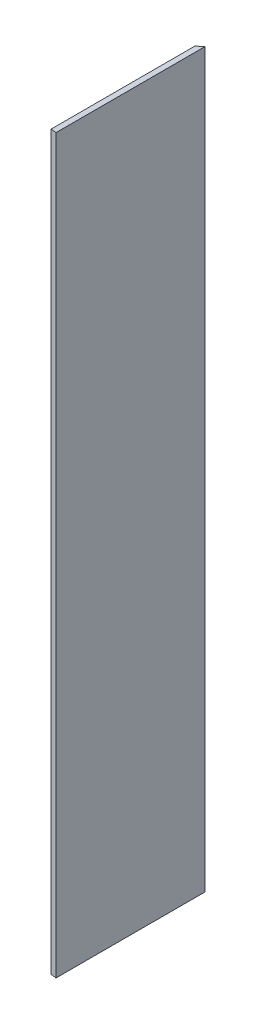
ISO-10303-21;
HEADER;
FILE_DESCRIPTION(('STEP AP214'),'2;1');
FILE_NAME('part.step','',(''),(''),'','','');
FILE_SCHEMA(('AUTOMOTIVE_DESIGN { 1 0 10303 214 1 1 1 1 }'));
ENDSEC;
DATA;
#1=APPLICATION_CONTEXT('core data for automotive mechanical design processes');
#2=APPLICATION_PROTOCOL_DEFINITION('international standard','automotive_design',2000,#1);
#3=PRODUCT_CONTEXT('',#1,'mechanical');
#4=PRODUCT('Part','Part','',(#3));
#5=PRODUCT_RELATED_PRODUCT_CATEGORY('part','',(#4));
#6=PRODUCT_DEFINITION_FORMATION('','',#4);
#7=PRODUCT_DEFINITION_CONTEXT('part definition',#1,'design');
#8=PRODUCT_DEFINITION('design','',#6,#7);
#9=PRODUCT_DEFINITION_SHAPE('','',#8);
#10=(LENGTH_UNIT() NAMED_UNIT(*) SI_UNIT(.MILLI.,.METRE.));
#11=(NAMED_UNIT(*) PLANE_ANGLE_UNIT() SI_UNIT($,.RADIAN.));
#12=(NAMED_UNIT(*) SI_UNIT($,.STERADIAN.) SOLID_ANGLE_UNIT());
#13=UNCERTAINTY_MEASURE_WITH_UNIT(LENGTH_MEASURE(1.E-05),#10,'distance_accuracy_value','');
#14=(GEOMETRIC_REPRESENTATION_CONTEXT(3) GLOBAL_UNCERTAINTY_ASSIGNED_CONTEXT((#13)) GLOBAL_UNIT_ASSIGNED_CONTEXT((#10,
#11,#12)) REPRESENTATION_CONTEXT('',''));
#15=CARTESIAN_POINT('',(0.,0.,0.));
#16=DIRECTION('',(0.,0.,1.));
#17=DIRECTION('',(1.,0.,0.));
#18=AXIS2_PLACEMENT_3D('',#15,#16,#17);
#19=CARTESIAN_POINT('',(5.02637904605247,533.,-0.491200201083911));
#20=DIRECTION('',(0.615496931497786,0.,0.788139281673493));
#21=DIRECTION('',(0.788139281673494,0.,-0.615496931497786));
#22=AXIS2_PLACEMENT_3D('',#19,#20,#21);
#23=PLANE('',#22);
#24=DIRECTION('',(-0.788139281673494,0.,0.615496931497786));
#25=VECTOR('',#24,1.);
#26=CARTESIAN_POINT('',(5.02637904605247,0.,-0.491200201083911));
#27=LINE('',#26,#25);
#28=CARTESIAN_POINT('',(5.02637904605247,0.,-0.491200201083911));
#29=VERTEX_POINT('',#28);
#30=CARTESIAN_POINT('',(1.02637904605246,0.,2.6325975631431));
#31=VERTEX_POINT('',#30);
#32=EDGE_CURVE('E96',#29,#31,#27,.T.);
#33=ORIENTED_EDGE('',*,*,#32,.T.);
#34=DIRECTION('',(0.,-1.,0.));
#35=VECTOR('',#34,1.);
#36=CARTESIAN_POINT('',(1.02637904605246,533.,2.6325975631431));
#37=LINE('',#36,#35);
#38=CARTESIAN_POINT('',(1.02637904605246,533.,2.6325975631431));
#39=VERTEX_POINT('',#38);
#40=EDGE_CURVE('E11',#39,#31,#37,.T.);
#41=ORIENTED_EDGE('',*,*,#40,.F.);
#42=DIRECTION('',(-0.788139281673494,0.,0.615496931497786));
#43=VECTOR('',#42,1.);
#44=CARTESIAN_POINT('',(5.02637904605247,533.,-0.491200201083911));
#45=LINE('',#44,#43);
#46=CARTESIAN_POINT('',(5.02637904605247,533.,-0.491200201083911));
#47=VERTEX_POINT('',#46);
#48=EDGE_CURVE('E84',#47,#39,#45,.T.);
#49=ORIENTED_EDGE('',*,*,#48,.F.);
#50=DIRECTION('',(0.,-1.,0.));
#51=VECTOR('',#50,1.);
#52=CARTESIAN_POINT('',(5.02637904605247,533.,-0.491200201083911));
#53=LINE('',#52,#51);
#54=EDGE_CURVE('E92',#47,#29,#53,.T.);
#55=ORIENTED_EDGE('',*,*,#54,.T.);
#56=EDGE_LOOP('',(#33,#41,#49,#55));
#57=FACE_BOUND('',#56,.T.);
#58=ADVANCED_FACE('F33',(#57),#23,.F.);
#59=CARTESIAN_POINT('',(1.02637904605246,533.,2.6325975631431));
#60=DIRECTION('',(1.,0.,0.));
#61=DIRECTION('',(0.,0.,-1.));
#62=AXIS2_PLACEMENT_3D('',#59,#60,#61);
#63=PLANE('',#62);
#64=DIRECTION('',(0.,0.,1.));
#65=VECTOR('',#64,1.);
#66=CARTESIAN_POINT('',(1.02637904605246,0.,2.6325975631431));
#67=LINE('',#66,#65);
#68=CARTESIAN_POINT('',(1.02637904605248,0.,107.324896907544));
#69=VERTEX_POINT('',#68);
#70=EDGE_CURVE('E88',#31,#69,#67,.T.);
#71=ORIENTED_EDGE('',*,*,#70,.T.);
#72=DIRECTION('',(0.,-1.,0.));
#73=VECTOR('',#72,1.);
#74=CARTESIAN_POINT('',(1.02637904605248,533.,107.324896907544));
#75=LINE('',#74,#73);
#76=CARTESIAN_POINT('',(1.02637904605248,533.,107.324896907544));
#77=VERTEX_POINT('',#76);
#78=EDGE_CURVE('E41',#77,#69,#75,.T.);
#79=ORIENTED_EDGE('',*,*,#78,.F.);
#80=DIRECTION('',(0.,0.,1.));
#81=VECTOR('',#80,1.);
#82=CARTESIAN_POINT('',(1.02637904605246,533.,2.6325975631431));
#83=LINE('',#82,#81);
#84=EDGE_CURVE('E79',#39,#77,#83,.T.);
#85=ORIENTED_EDGE('',*,*,#84,.F.);
#86=ORIENTED_EDGE('',*,*,#40,.T.);
#87=EDGE_LOOP('',(#71,#79,#85,#86));
#88=FACE_BOUND('',#87,.T.);
#89=ADVANCED_FACE('F87',(#88),#63,.F.);
#90=CARTESIAN_POINT('',(1.02637904605248,533.,107.324896907544));
#91=DIRECTION('',(0.12742836011959,0.,-0.991847777149917));
#92=DIRECTION('',(-0.991847777149917,0.,-0.12742836011959));
#93=AXIS2_PLACEMENT_3D('',#90,#91,#92);
#94=PLANE('',#93);
#95=DIRECTION('',(0.991847777149917,0.,0.12742836011959));
#96=VECTOR('',#95,1.);
#97=CARTESIAN_POINT('',(1.02637904605248,0.,107.324896907544));
#98=LINE('',#97,#96);
#99=CARTESIAN_POINT('',(5.02637904605247,0.,107.838799798916));
#100=VERTEX_POINT('',#99);
#101=EDGE_CURVE('E66',#69,#100,#98,.T.);
#102=ORIENTED_EDGE('',*,*,#101,.T.);
#103=DIRECTION('',(0.,-1.,0.));
#104=VECTOR('',#103,1.);
#105=CARTESIAN_POINT('',(5.02637904605247,533.,107.838799798916));
#106=LINE('',#105,#104);
#107=CARTESIAN_POINT('',(5.02637904605247,533.,107.838799798916));
#108=VERTEX_POINT('',#107);
#109=EDGE_CURVE('E89',#108,#100,#106,.T.);
#110=ORIENTED_EDGE('',*,*,#109,.F.);
#111=DIRECTION('',(0.991847777149917,0.,0.12742836011959));
#112=VECTOR('',#111,1.);
#113=CARTESIAN_POINT('',(1.02637904605248,533.,107.324896907544));
#114=LINE('',#113,#112);
#115=EDGE_CURVE('E82',#77,#108,#114,.T.);
#116=ORIENTED_EDGE('',*,*,#115,.F.);
#117=ORIENTED_EDGE('',*,*,#78,.T.);
#118=EDGE_LOOP('',(#102,#110,#116,#117));
#119=FACE_BOUND('',#118,.T.);
#120=ADVANCED_FACE('F90',(#119),#94,.F.);
#121=CARTESIAN_POINT('',(5.02637904605247,533.,107.838799798916));
#122=DIRECTION('',(-1.,0.,0.));
#123=DIRECTION('',(0.,0.,1.));
#124=AXIS2_PLACEMENT_3D('',#121,#122,#123);
#125=PLANE('',#124);
#126=DIRECTION('',(0.,0.,-1.));
#127=VECTOR('',#126,1.);
#128=CARTESIAN_POINT('',(5.02637904605247,0.,107.838799798916));
#129=LINE('',#128,#127);
#130=EDGE_CURVE('E72',#100,#29,#129,.T.);
#131=ORIENTED_EDGE('',*,*,#130,.T.);
#132=ORIENTED_EDGE('',*,*,#54,.F.);
#133=DIRECTION('',(0.,0.,-1.));
#134=VECTOR('',#133,1.);
#135=CARTESIAN_POINT('',(5.02637904605247,533.,107.838799798916));
#136=LINE('',#135,#134);
#137=EDGE_CURVE('E49',#108,#47,#136,.T.);
#138=ORIENTED_EDGE('',*,*,#137,.F.);
#139=ORIENTED_EDGE('',*,*,#109,.T.);
#140=EDGE_LOOP('',(#131,#132,#138,#139));
#141=FACE_BOUND('',#140,.T.);
#142=ADVANCED_FACE('F103',(#141),#125,.F.);
#143=CARTESIAN_POINT('',(1.02637904605246,533.,2.6325975631431));
#144=DIRECTION('',(0.,1.,0.));
#145=DIRECTION('',(0.,0.,1.));
#146=AXIS2_PLACEMENT_3D('',#143,#144,#145);
#147=PLANE('',#146);
#148=ORIENTED_EDGE('',*,*,#48,.T.);
#149=ORIENTED_EDGE('',*,*,#84,.T.);
#150=ORIENTED_EDGE('',*,*,#115,.T.);
#151=ORIENTED_EDGE('',*,*,#137,.T.);
#152=EDGE_LOOP('',(#148,#149,#150,#151));
#153=FACE_BOUND('',#152,.T.);
#154=ADVANCED_FACE('F80',(#153),#147,.T.);
#155=CARTESIAN_POINT('',(1.02637904605246,0.,2.6325975631431));
#156=DIRECTION('',(0.,1.,0.));
#157=DIRECTION('',(0.,0.,1.));
#158=AXIS2_PLACEMENT_3D('',#155,#156,#157);
#159=PLANE('',#158);
#160=ORIENTED_EDGE('',*,*,#32,.F.);
#161=ORIENTED_EDGE('',*,*,#130,.F.);
#162=ORIENTED_EDGE('',*,*,#101,.F.);
#163=ORIENTED_EDGE('',*,*,#70,.F.);
#164=EDGE_LOOP('',(#160,#161,#162,#163));
#165=FACE_BOUND('',#164,.T.);
#166=ADVANCED_FACE('F106',(#165),#159,.F.);
#167=CLOSED_SHELL('',(#58,#89,#120,#142,#154,#166));
#168=MANIFOLD_SOLID_BREP('B2',#167);
#169=ADVANCED_BREP_SHAPE_REPRESENTATION('',(#18,#168),#14);
#170=SHAPE_DEFINITION_REPRESENTATION(#9,#169);
ENDSEC;
END-ISO-10303-21;
